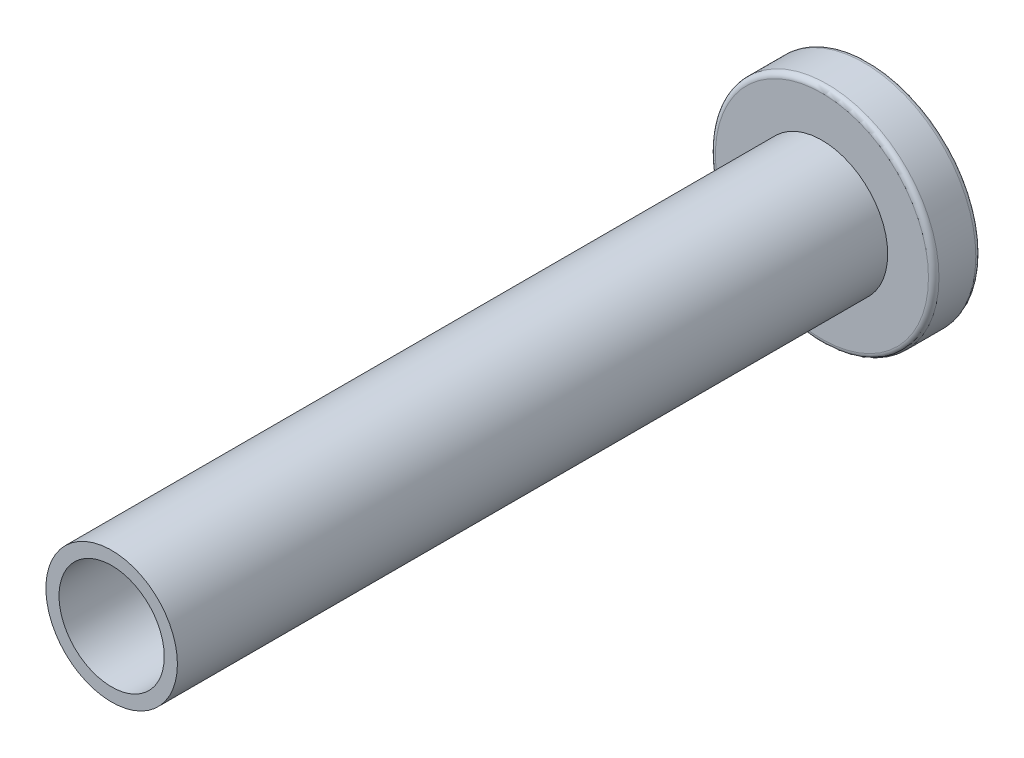
ISO-10303-21;
HEADER;
FILE_DESCRIPTION(('STEP AP214'),'2;1');
FILE_NAME('part.step','',(''),(''),'','','');
FILE_SCHEMA(('AUTOMOTIVE_DESIGN { 1 0 10303 214 1 1 1 1 }'));
ENDSEC;
DATA;
#1=APPLICATION_CONTEXT('core data for automotive mechanical design processes');
#2=APPLICATION_PROTOCOL_DEFINITION('international standard','automotive_design',2000,#1);
#3=PRODUCT_CONTEXT('',#1,'mechanical');
#4=PRODUCT('Part','Part','',(#3));
#5=PRODUCT_RELATED_PRODUCT_CATEGORY('part','',(#4));
#6=PRODUCT_DEFINITION_FORMATION('','',#4);
#7=PRODUCT_DEFINITION_CONTEXT('part definition',#1,'design');
#8=PRODUCT_DEFINITION('design','',#6,#7);
#9=PRODUCT_DEFINITION_SHAPE('','',#8);
#10=(LENGTH_UNIT() NAMED_UNIT(*) SI_UNIT(.MILLI.,.METRE.));
#11=(NAMED_UNIT(*) PLANE_ANGLE_UNIT() SI_UNIT($,.RADIAN.));
#12=(NAMED_UNIT(*) SI_UNIT($,.STERADIAN.) SOLID_ANGLE_UNIT());
#13=UNCERTAINTY_MEASURE_WITH_UNIT(LENGTH_MEASURE(1.E-05),#10,'distance_accuracy_value','');
#14=(GEOMETRIC_REPRESENTATION_CONTEXT(3) GLOBAL_UNCERTAINTY_ASSIGNED_CONTEXT((#13)) GLOBAL_UNIT_ASSIGNED_CONTEXT((#10,
#11,#12)) REPRESENTATION_CONTEXT('',''));
#15=CARTESIAN_POINT('',(0.,0.,0.));
#16=DIRECTION('',(0.,0.,1.));
#17=DIRECTION('',(1.,0.,0.));
#18=AXIS2_PLACEMENT_3D('',#15,#16,#17);
#19=CARTESIAN_POINT('',(0.,0.,1.8));
#20=DIRECTION('',(0.,0.,-1.));
#21=DIRECTION('',(-1.,0.,0.));
#22=AXIS2_PLACEMENT_3D('',#19,#20,#21);
#23=CYLINDRICAL_SURFACE('',#22,4.25);
#24=CARTESIAN_POINT('',(0.,0.,0.2));
#25=DIRECTION('',(0.,0.,1.));
#26=DIRECTION('',(1.,0.,0.));
#27=AXIS2_PLACEMENT_3D('',#24,#25,#26);
#28=CIRCLE('',#27,4.25);
#29=CARTESIAN_POINT('',(4.25,0.,0.2));
#30=VERTEX_POINT('',#29);
#31=EDGE_CURVE('E187',#30,#30,#28,.T.);
#32=ORIENTED_EDGE('',*,*,#31,.T.);
#33=EDGE_LOOP('',(#32));
#34=FACE_BOUND('',#33,.T.);
#35=CARTESIAN_POINT('',(0.,0.,1.6));
#36=DIRECTION('',(0.,0.,1.));
#37=DIRECTION('',(1.,0.,0.));
#38=AXIS2_PLACEMENT_3D('',#35,#36,#37);
#39=CIRCLE('',#38,4.25);
#40=CARTESIAN_POINT('',(4.25,0.,1.6));
#41=VERTEX_POINT('',#40);
#42=EDGE_CURVE('E183',#41,#41,#39,.F.);
#43=ORIENTED_EDGE('',*,*,#42,.T.);
#44=EDGE_LOOP('',(#43));
#45=FACE_BOUND('',#44,.T.);
#46=ADVANCED_FACE('F43',(#34,#45),#23,.T.);
#47=CARTESIAN_POINT('',(0.,0.,1.8));
#48=DIRECTION('',(0.,0.,1.));
#49=DIRECTION('',(1.,0.,0.));
#50=AXIS2_PLACEMENT_3D('',#47,#48,#49);
#51=PLANE('',#50);
#52=CARTESIAN_POINT('',(0.,0.,1.8));
#53=DIRECTION('',(0.,0.,1.));
#54=DIRECTION('',(1.,0.,0.));
#55=AXIS2_PLACEMENT_3D('',#52,#53,#54);
#56=CIRCLE('',#55,4.05);
#57=CARTESIAN_POINT('',(4.05,0.,1.8));
#58=VERTEX_POINT('',#57);
#59=EDGE_CURVE('E11',#58,#58,#56,.T.);
#60=ORIENTED_EDGE('',*,*,#59,.T.);
#61=EDGE_LOOP('',(#60));
#62=FACE_BOUND('',#61,.T.);
#63=CARTESIAN_POINT('',(0.,0.,1.8));
#64=DIRECTION('',(0.,0.,1.));
#65=DIRECTION('',(1.,0.,0.));
#66=AXIS2_PLACEMENT_3D('',#63,#64,#65);
#67=CIRCLE('',#66,2.5);
#68=CARTESIAN_POINT('',(2.5,0.,1.8));
#69=VERTEX_POINT('',#68);
#70=EDGE_CURVE('E171',#69,#69,#67,.T.);
#71=ORIENTED_EDGE('',*,*,#70,.F.);
#72=EDGE_LOOP('',(#71));
#73=FACE_BOUND('',#72,.T.);
#74=ADVANCED_FACE('F204',(#62,#73),#51,.T.);
#75=CARTESIAN_POINT('',(0.,0.,0.));
#76=DIRECTION('',(0.,0.,1.));
#77=DIRECTION('',(1.,0.,0.));
#78=AXIS2_PLACEMENT_3D('',#75,#76,#77);
#79=PLANE('',#78);
#80=DIRECTION('',(0.5,0.866025403784438,0.));
#81=VECTOR('',#80,1.);
#82=CARTESIAN_POINT('',(-1.44337567297407,0.,0.));
#83=LINE('',#82,#81);
#84=CARTESIAN_POINT('',(-1.44337567297407,0.,0.));
#85=VERTEX_POINT('',#84);
#86=CARTESIAN_POINT('',(-0.721687836487032,1.25,0.));
#87=VERTEX_POINT('',#86);
#88=EDGE_CURVE('E139',#85,#87,#83,.T.);
#89=ORIENTED_EDGE('',*,*,#88,.F.);
#90=DIRECTION('',(-0.5,0.866025403784438,0.));
#91=VECTOR('',#90,1.);
#92=CARTESIAN_POINT('',(-0.721687836487033,-1.25,0.));
#93=LINE('',#92,#91);
#94=CARTESIAN_POINT('',(-0.721687836487033,-1.25,0.));
#95=VERTEX_POINT('',#94);
#96=EDGE_CURVE('E59',#95,#85,#93,.T.);
#97=ORIENTED_EDGE('',*,*,#96,.F.);
#98=DIRECTION('',(-1.,0.,0.));
#99=VECTOR('',#98,1.);
#100=CARTESIAN_POINT('',(0.721687836487032,-1.25,0.));
#101=LINE('',#100,#99);
#102=CARTESIAN_POINT('',(0.721687836487032,-1.25,0.));
#103=VERTEX_POINT('',#102);
#104=EDGE_CURVE('E152',#103,#95,#101,.T.);
#105=ORIENTED_EDGE('',*,*,#104,.F.);
#106=DIRECTION('',(-0.5,-0.866025403784438,0.));
#107=VECTOR('',#106,1.);
#108=CARTESIAN_POINT('',(1.44337567297406,0.,0.));
#109=LINE('',#108,#107);
#110=CARTESIAN_POINT('',(1.44337567297406,0.,0.));
#111=VERTEX_POINT('',#110);
#112=EDGE_CURVE('E149',#111,#103,#109,.T.);
#113=ORIENTED_EDGE('',*,*,#112,.F.);
#114=DIRECTION('',(0.5,-0.866025403784438,0.));
#115=VECTOR('',#114,1.);
#116=CARTESIAN_POINT('',(0.721687836487032,1.25,0.));
#117=LINE('',#116,#115);
#118=CARTESIAN_POINT('',(0.721687836487032,1.25,0.));
#119=VERTEX_POINT('',#118);
#120=EDGE_CURVE('E107',#119,#111,#117,.T.);
#121=ORIENTED_EDGE('',*,*,#120,.F.);
#122=DIRECTION('',(1.,0.,0.));
#123=VECTOR('',#122,1.);
#124=CARTESIAN_POINT('',(-0.721687836487032,1.25,0.));
#125=LINE('',#124,#123);
#126=EDGE_CURVE('E143',#87,#119,#125,.T.);
#127=ORIENTED_EDGE('',*,*,#126,.F.);
#128=EDGE_LOOP('',(#89,#97,#105,#113,#121,#127));
#129=FACE_BOUND('',#128,.T.);
#130=CARTESIAN_POINT('',(0.,0.,0.));
#131=DIRECTION('',(0.,0.,1.));
#132=DIRECTION('',(1.,0.,0.));
#133=AXIS2_PLACEMENT_3D('',#130,#131,#132);
#134=CIRCLE('',#133,4.05);
#135=CARTESIAN_POINT('',(4.05,0.,0.));
#136=VERTEX_POINT('',#135);
#137=EDGE_CURVE('E52',#136,#136,#134,.F.);
#138=ORIENTED_EDGE('',*,*,#137,.T.);
#139=EDGE_LOOP('',(#138));
#140=FACE_BOUND('',#139,.T.);
#141=ADVANCED_FACE('F194',(#129,#140),#79,.F.);
#142=CARTESIAN_POINT('',(0.,0.,28.8));
#143=DIRECTION('',(0.,0.,1.));
#144=DIRECTION('',(1.,0.,0.));
#145=AXIS2_PLACEMENT_3D('',#142,#143,#144);
#146=PLANE('',#145);
#147=CARTESIAN_POINT('',(0.,0.,28.8));
#148=DIRECTION('',(0.,0.,1.));
#149=DIRECTION('',(1.,0.,0.));
#150=AXIS2_PLACEMENT_3D('',#147,#148,#149);
#151=CIRCLE('',#150,2.5);
#152=CARTESIAN_POINT('',(2.5,0.,28.8));
#153=VERTEX_POINT('',#152);
#154=EDGE_CURVE('E172',#153,#153,#151,.T.);
#155=ORIENTED_EDGE('',*,*,#154,.T.);
#156=EDGE_LOOP('',(#155));
#157=FACE_BOUND('',#156,.T.);
#158=CARTESIAN_POINT('',(0.,0.,28.8));
#159=DIRECTION('',(0.,0.,1.));
#160=DIRECTION('',(1.,0.,0.));
#161=AXIS2_PLACEMENT_3D('',#158,#159,#160);
#162=CIRCLE('',#161,2.);
#163=CARTESIAN_POINT('',(2.,0.,28.8));
#164=VERTEX_POINT('',#163);
#165=EDGE_CURVE('E158',#164,#164,#162,.T.);
#166=ORIENTED_EDGE('',*,*,#165,.F.);
#167=EDGE_LOOP('',(#166));
#168=FACE_BOUND('',#167,.T.);
#169=ADVANCED_FACE('F221',(#157,#168),#146,.T.);
#170=CARTESIAN_POINT('',(0.,0.,28.8));
#171=DIRECTION('',(0.,0.,-1.));
#172=DIRECTION('',(-1.,0.,0.));
#173=AXIS2_PLACEMENT_3D('',#170,#171,#172);
#174=CYLINDRICAL_SURFACE('',#173,2.5);
#175=ORIENTED_EDGE('',*,*,#154,.F.);
#176=EDGE_LOOP('',(#175));
#177=FACE_BOUND('',#176,.T.);
#178=ORIENTED_EDGE('',*,*,#70,.T.);
#179=EDGE_LOOP('',(#178));
#180=FACE_BOUND('',#179,.T.);
#181=ADVANCED_FACE('F218',(#177,#180),#174,.T.);
#182=CARTESIAN_POINT('',(0.,0.,28.8));
#183=DIRECTION('',(0.,0.,-1.));
#184=DIRECTION('',(-1.,0.,0.));
#185=AXIS2_PLACEMENT_3D('',#182,#183,#184);
#186=CYLINDRICAL_SURFACE('',#185,2.);
#187=ORIENTED_EDGE('',*,*,#165,.T.);
#188=EDGE_LOOP('',(#187));
#189=FACE_BOUND('',#188,.T.);
#190=CARTESIAN_POINT('',(0.,0.,1.8));
#191=DIRECTION('',(0.,0.,1.));
#192=DIRECTION('',(1.,0.,0.));
#193=AXIS2_PLACEMENT_3D('',#190,#191,#192);
#194=CIRCLE('',#193,2.);
#195=CARTESIAN_POINT('',(2.,0.,1.8));
#196=VERTEX_POINT('',#195);
#197=EDGE_CURVE('E176',#196,#196,#194,.F.);
#198=ORIENTED_EDGE('',*,*,#197,.T.);
#199=EDGE_LOOP('',(#198));
#200=FACE_BOUND('',#199,.T.);
#201=ADVANCED_FACE('F220',(#189,#200),#186,.F.);
#202=ORIENTED_EDGE('',*,*,#197,.F.);
#203=EDGE_LOOP('',(#202));
#204=FACE_BOUND('',#203,.T.);
#205=ADVANCED_FACE('F199',(#204),#51,.T.);
#206=CARTESIAN_POINT('',(0.,0.,0.2));
#207=DIRECTION('',(0.,0.,1.));
#208=DIRECTION('',(1.,0.,0.));
#209=AXIS2_PLACEMENT_3D('',#206,#207,#208);
#210=TOROIDAL_SURFACE('',#209,4.05,0.2);
#211=ORIENTED_EDGE('',*,*,#137,.F.);
#212=EDGE_LOOP('',(#211));
#213=FACE_BOUND('',#212,.T.);
#214=ORIENTED_EDGE('',*,*,#31,.F.);
#215=EDGE_LOOP('',(#214));
#216=FACE_BOUND('',#215,.T.);
#217=ADVANCED_FACE('F196',(#213,#216),#210,.T.);
#218=CARTESIAN_POINT('',(0.,0.,1.6));
#219=DIRECTION('',(0.,0.,1.));
#220=DIRECTION('',(1.,0.,0.));
#221=AXIS2_PLACEMENT_3D('',#218,#219,#220);
#222=TOROIDAL_SURFACE('',#221,4.05,0.2);
#223=ORIENTED_EDGE('',*,*,#42,.F.);
#224=EDGE_LOOP('',(#223));
#225=FACE_BOUND('',#224,.T.);
#226=ORIENTED_EDGE('',*,*,#59,.F.);
#227=EDGE_LOOP('',(#226));
#228=FACE_BOUND('',#227,.T.);
#229=ADVANCED_FACE('F45',(#225,#228),#222,.T.);
#230=CARTESIAN_POINT('',(-0.721687836487033,-1.25,1.5));
#231=DIRECTION('',(-0.866025403784439,-0.5,0.));
#232=DIRECTION('',(0.5,-0.866025403784439,0.));
#233=AXIS2_PLACEMENT_3D('',#230,#231,#232);
#234=PLANE('',#233);
#235=ORIENTED_EDGE('',*,*,#96,.T.);
#236=DIRECTION('',(0.,0.,-1.));
#237=VECTOR('',#236,1.);
#238=CARTESIAN_POINT('',(-1.44337567297407,0.,1.5));
#239=LINE('',#238,#237);
#240=CARTESIAN_POINT('',(-1.44337567297407,0.,1.5));
#241=VERTEX_POINT('',#240);
#242=EDGE_CURVE('E89',#241,#85,#239,.T.);
#243=ORIENTED_EDGE('',*,*,#242,.F.);
#244=DIRECTION('',(-0.5,0.866025403784438,0.));
#245=VECTOR('',#244,1.);
#246=CARTESIAN_POINT('',(-0.721687836487033,-1.25,1.5));
#247=LINE('',#246,#245);
#248=CARTESIAN_POINT('',(-0.721687836487033,-1.25,1.5));
#249=VERTEX_POINT('',#248);
#250=EDGE_CURVE('E155',#249,#241,#247,.T.);
#251=ORIENTED_EDGE('',*,*,#250,.F.);
#252=DIRECTION('',(0.,0.,-1.));
#253=VECTOR('',#252,1.);
#254=CARTESIAN_POINT('',(-0.721687836487033,-1.25,1.5));
#255=LINE('',#254,#253);
#256=EDGE_CURVE('E67',#249,#95,#255,.T.);
#257=ORIENTED_EDGE('',*,*,#256,.T.);
#258=EDGE_LOOP('',(#235,#243,#251,#257));
#259=FACE_BOUND('',#258,.T.);
#260=ADVANCED_FACE('F210',(#259),#234,.F.);
#261=CARTESIAN_POINT('',(0.721687836487032,-1.25,1.5));
#262=DIRECTION('',(0.,-1.,0.));
#263=DIRECTION('',(1.,0.,0.));
#264=AXIS2_PLACEMENT_3D('',#261,#262,#263);
#265=PLANE('',#264);
#266=ORIENTED_EDGE('',*,*,#104,.T.);
#267=ORIENTED_EDGE('',*,*,#256,.F.);
#268=DIRECTION('',(-1.,0.,0.));
#269=VECTOR('',#268,1.);
#270=CARTESIAN_POINT('',(0.721687836487032,-1.25,1.5));
#271=LINE('',#270,#269);
#272=CARTESIAN_POINT('',(0.721687836487032,-1.25,1.5));
#273=VERTEX_POINT('',#272);
#274=EDGE_CURVE('E121',#273,#249,#271,.T.);
#275=ORIENTED_EDGE('',*,*,#274,.F.);
#276=DIRECTION('',(0.,0.,-1.));
#277=VECTOR('',#276,1.);
#278=CARTESIAN_POINT('',(0.721687836487032,-1.25,1.5));
#279=LINE('',#278,#277);
#280=EDGE_CURVE('E112',#273,#103,#279,.T.);
#281=ORIENTED_EDGE('',*,*,#280,.T.);
#282=EDGE_LOOP('',(#266,#267,#275,#281));
#283=FACE_BOUND('',#282,.T.);
#284=ADVANCED_FACE('F247',(#283),#265,.F.);
#285=CARTESIAN_POINT('',(1.44337567297406,0.,1.5));
#286=DIRECTION('',(0.866025403784439,-0.5,0.));
#287=DIRECTION('',(0.5,0.866025403784439,0.));
#288=AXIS2_PLACEMENT_3D('',#285,#286,#287);
#289=PLANE('',#288);
#290=ORIENTED_EDGE('',*,*,#112,.T.);
#291=ORIENTED_EDGE('',*,*,#280,.F.);
#292=DIRECTION('',(-0.5,-0.866025403784438,0.));
#293=VECTOR('',#292,1.);
#294=CARTESIAN_POINT('',(1.44337567297406,0.,1.5));
#295=LINE('',#294,#293);
#296=CARTESIAN_POINT('',(1.44337567297406,0.,1.5));
#297=VERTEX_POINT('',#296);
#298=EDGE_CURVE('E116',#297,#273,#295,.T.);
#299=ORIENTED_EDGE('',*,*,#298,.F.);
#300=DIRECTION('',(0.,0.,-1.));
#301=VECTOR('',#300,1.);
#302=CARTESIAN_POINT('',(1.44337567297406,0.,1.5));
#303=LINE('',#302,#301);
#304=EDGE_CURVE('E100',#297,#111,#303,.T.);
#305=ORIENTED_EDGE('',*,*,#304,.T.);
#306=EDGE_LOOP('',(#290,#291,#299,#305));
#307=FACE_BOUND('',#306,.T.);
#308=ADVANCED_FACE('F117',(#307),#289,.F.);
#309=CARTESIAN_POINT('',(0.721687836487032,1.25,1.5));
#310=DIRECTION('',(0.866025403784439,0.5,0.));
#311=DIRECTION('',(-0.5,0.866025403784439,0.));
#312=AXIS2_PLACEMENT_3D('',#309,#310,#311);
#313=PLANE('',#312);
#314=ORIENTED_EDGE('',*,*,#120,.T.);
#315=ORIENTED_EDGE('',*,*,#304,.F.);
#316=DIRECTION('',(0.5,-0.866025403784438,0.));
#317=VECTOR('',#316,1.);
#318=CARTESIAN_POINT('',(0.721687836487032,1.25,1.5));
#319=LINE('',#318,#317);
#320=CARTESIAN_POINT('',(0.721687836487032,1.25,1.5));
#321=VERTEX_POINT('',#320);
#322=EDGE_CURVE('E104',#321,#297,#319,.T.);
#323=ORIENTED_EDGE('',*,*,#322,.F.);
#324=DIRECTION('',(0.,0.,-1.));
#325=VECTOR('',#324,1.);
#326=CARTESIAN_POINT('',(0.721687836487032,1.25,1.5));
#327=LINE('',#326,#325);
#328=EDGE_CURVE('E113',#321,#119,#327,.T.);
#329=ORIENTED_EDGE('',*,*,#328,.T.);
#330=EDGE_LOOP('',(#314,#315,#323,#329));
#331=FACE_BOUND('',#330,.T.);
#332=ADVANCED_FACE('F102',(#331),#313,.F.);
#333=CARTESIAN_POINT('',(-0.721687836487032,1.25,1.5));
#334=DIRECTION('',(0.,1.,0.));
#335=DIRECTION('',(0.,0.,1.));
#336=AXIS2_PLACEMENT_3D('',#333,#334,#335);
#337=PLANE('',#336);
#338=ORIENTED_EDGE('',*,*,#126,.T.);
#339=ORIENTED_EDGE('',*,*,#328,.F.);
#340=DIRECTION('',(1.,0.,0.));
#341=VECTOR('',#340,1.);
#342=CARTESIAN_POINT('',(-0.721687836487032,1.25,1.5));
#343=LINE('',#342,#341);
#344=CARTESIAN_POINT('',(-0.721687836487032,1.25,1.5));
#345=VERTEX_POINT('',#344);
#346=EDGE_CURVE('E127',#345,#321,#343,.T.);
#347=ORIENTED_EDGE('',*,*,#346,.F.);
#348=DIRECTION('',(0.,0.,-1.));
#349=VECTOR('',#348,1.);
#350=CARTESIAN_POINT('',(-0.721687836487032,1.25,1.5));
#351=LINE('',#350,#349);
#352=EDGE_CURVE('E163',#345,#87,#351,.T.);
#353=ORIENTED_EDGE('',*,*,#352,.T.);
#354=EDGE_LOOP('',(#338,#339,#347,#353));
#355=FACE_BOUND('',#354,.T.);
#356=ADVANCED_FACE('F256',(#355),#337,.F.);
#357=CARTESIAN_POINT('',(-1.44337567297407,0.,1.5));
#358=DIRECTION('',(-0.866025403784438,0.5,0.));
#359=DIRECTION('',(-0.5,-0.866025403784438,0.));
#360=AXIS2_PLACEMENT_3D('',#357,#358,#359);
#361=PLANE('',#360);
#362=ORIENTED_EDGE('',*,*,#88,.T.);
#363=ORIENTED_EDGE('',*,*,#352,.F.);
#364=DIRECTION('',(0.5,0.866025403784438,0.));
#365=VECTOR('',#364,1.);
#366=CARTESIAN_POINT('',(-1.44337567297407,0.,1.5));
#367=LINE('',#366,#365);
#368=EDGE_CURVE('E131',#241,#345,#367,.T.);
#369=ORIENTED_EDGE('',*,*,#368,.F.);
#370=ORIENTED_EDGE('',*,*,#242,.T.);
#371=EDGE_LOOP('',(#362,#363,#369,#370));
#372=FACE_BOUND('',#371,.T.);
#373=ADVANCED_FACE('F242',(#372),#361,.F.);
#374=CARTESIAN_POINT('',(0.,0.,1.5));
#375=DIRECTION('',(0.,0.,-1.));
#376=DIRECTION('',(-1.,0.,0.));
#377=AXIS2_PLACEMENT_3D('',#374,#375,#376);
#378=PLANE('',#377);
#379=ORIENTED_EDGE('',*,*,#250,.T.);
#380=ORIENTED_EDGE('',*,*,#368,.T.);
#381=ORIENTED_EDGE('',*,*,#346,.T.);
#382=ORIENTED_EDGE('',*,*,#322,.T.);
#383=ORIENTED_EDGE('',*,*,#298,.T.);
#384=ORIENTED_EDGE('',*,*,#274,.T.);
#385=EDGE_LOOP('',(#379,#380,#381,#382,#383,#384));
#386=FACE_BOUND('',#385,.T.);
#387=ADVANCED_FACE('F124',(#386),#378,.T.);
#388=CLOSED_SHELL('',(#46,#74,#141,#169,#181,#201,#205,#217,#229,#260,#284,#308,#332,#356,#373,#387));
#389=MANIFOLD_SOLID_BREP('B2',#388);
#390=ADVANCED_BREP_SHAPE_REPRESENTATION('',(#18,#389),#14);
#391=SHAPE_DEFINITION_REPRESENTATION(#9,#390);
ENDSEC;
END-ISO-10303-21;
